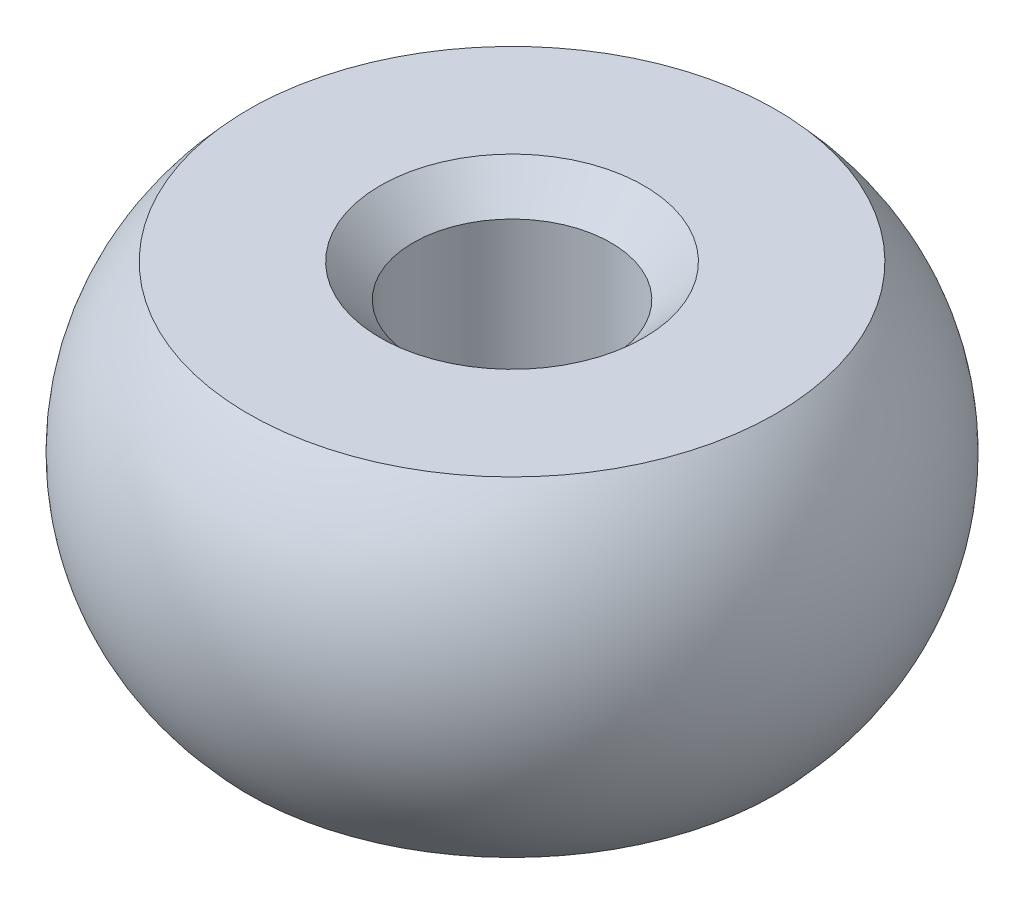
ISO-10303-21;
HEADER;
FILE_DESCRIPTION(('STEP AP214'),'2;1');
FILE_NAME('part.step','',(''),(''),'','','');
FILE_SCHEMA(('AUTOMOTIVE_DESIGN { 1 0 10303 214 1 1 1 1 }'));
ENDSEC;
DATA;
#1=APPLICATION_CONTEXT('core data for automotive mechanical design processes');
#2=APPLICATION_PROTOCOL_DEFINITION('international standard','automotive_design',2000,#1);
#3=PRODUCT_CONTEXT('',#1,'mechanical');
#4=PRODUCT('Part','Part','',(#3));
#5=PRODUCT_RELATED_PRODUCT_CATEGORY('part','',(#4));
#6=PRODUCT_DEFINITION_FORMATION('','',#4);
#7=PRODUCT_DEFINITION_CONTEXT('part definition',#1,'design');
#8=PRODUCT_DEFINITION('design','',#6,#7);
#9=PRODUCT_DEFINITION_SHAPE('','',#8);
#10=(LENGTH_UNIT() NAMED_UNIT(*) SI_UNIT(.MILLI.,.METRE.));
#11=(NAMED_UNIT(*) PLANE_ANGLE_UNIT() SI_UNIT($,.RADIAN.));
#12=(NAMED_UNIT(*) SI_UNIT($,.STERADIAN.) SOLID_ANGLE_UNIT());
#13=UNCERTAINTY_MEASURE_WITH_UNIT(LENGTH_MEASURE(1.E-05),#10,'distance_accuracy_value','');
#14=(GEOMETRIC_REPRESENTATION_CONTEXT(3) GLOBAL_UNCERTAINTY_ASSIGNED_CONTEXT((#13)) GLOBAL_UNIT_ASSIGNED_CONTEXT((#10,
#11,#12)) REPRESENTATION_CONTEXT('',''));
#15=CARTESIAN_POINT('',(0.,0.,0.));
#16=DIRECTION('',(0.,0.,1.));
#17=DIRECTION('',(1.,0.,0.));
#18=AXIS2_PLACEMENT_3D('',#15,#16,#17);
#19=CARTESIAN_POINT('',(1.5,2.5,0.));
#20=DIRECTION('',(0.,1.,0.));
#21=DIRECTION('',(-1.,0.,0.));
#22=AXIS2_PLACEMENT_3D('',#19,#20,#21);
#23=PLANE('',#22);
#24=CARTESIAN_POINT('',(0.,2.49999999999999,0.));
#25=DIRECTION('',(0.,1.,0.));
#26=DIRECTION('',(-1.,0.,0.));
#27=AXIS2_PLACEMENT_3D('',#24,#25,#26);
#28=CIRCLE('',#27,1.99999999999998);
#29=CARTESIAN_POINT('',(-1.99999999999998,2.49999999999998,0.));
#30=VERTEX_POINT('',#29);
#31=EDGE_CURVE('E49',#30,#30,#28,.F.);
#32=ORIENTED_EDGE('',*,*,#31,.T.);
#33=EDGE_LOOP('',(#32));
#34=FACE_BOUND('',#33,.T.);
#35=CARTESIAN_POINT('',(0.,2.49999999999999,0.));
#36=DIRECTION('',(0.,-1.,0.));
#37=DIRECTION('',(1.,0.,0.));
#38=AXIS2_PLACEMENT_3D('',#35,#36,#37);
#39=CIRCLE('',#38,4.00000000000001);
#40=CARTESIAN_POINT('',(4.,2.5,0.));
#41=VERTEX_POINT('',#40);
#42=EDGE_CURVE('E54',#41,#41,#39,.T.);
#43=ORIENTED_EDGE('',*,*,#42,.F.);
#44=EDGE_LOOP('',(#43));
#45=FACE_BOUND('',#44,.T.);
#46=ADVANCED_FACE('F33',(#34,#45),#23,.T.);
#47=CARTESIAN_POINT('',(0.,0.,0.));
#48=DIRECTION('',(0.,-1.,0.));
#49=DIRECTION('',(1.,0.,0.));
#50=AXIS2_PLACEMENT_3D('',#47,#48,#49);
#51=DEGENERATE_TOROIDAL_SURFACE('',#50,1.375,3.625,.T.);
#52=ORIENTED_EDGE('',*,*,#42,.T.);
#53=EDGE_LOOP('',(#52));
#54=FACE_BOUND('',#53,.T.);
#55=CARTESIAN_POINT('',(0.,-2.50000000000002,0.));
#56=DIRECTION('',(0.,-1.,0.));
#57=DIRECTION('',(1.,0.,0.));
#58=AXIS2_PLACEMENT_3D('',#55,#56,#57);
#59=CIRCLE('',#58,3.99999999999999);
#60=CARTESIAN_POINT('',(4.,-2.5,0.));
#61=VERTEX_POINT('',#60);
#62=EDGE_CURVE('E57',#61,#61,#59,.T.);
#63=ORIENTED_EDGE('',*,*,#62,.F.);
#64=EDGE_LOOP('',(#63));
#65=FACE_BOUND('',#64,.T.);
#66=ADVANCED_FACE('F63',(#54,#65),#51,.T.);
#67=CARTESIAN_POINT('',(1.5,-2.5,0.));
#68=DIRECTION('',(0.,-1.,0.));
#69=DIRECTION('',(1.,0.,0.));
#70=AXIS2_PLACEMENT_3D('',#67,#68,#69);
#71=PLANE('',#70);
#72=CARTESIAN_POINT('',(0.,-2.50000000000001,0.));
#73=DIRECTION('',(0.,-1.,0.));
#74=DIRECTION('',(1.,0.,0.));
#75=AXIS2_PLACEMENT_3D('',#72,#73,#74);
#76=CIRCLE('',#75,2.00000000000001);
#77=CARTESIAN_POINT('',(2.00000000000002,-2.5,0.));
#78=VERTEX_POINT('',#77);
#79=EDGE_CURVE('E10',#78,#78,#76,.F.);
#80=ORIENTED_EDGE('',*,*,#79,.T.);
#81=EDGE_LOOP('',(#80));
#82=FACE_BOUND('',#81,.T.);
#83=ORIENTED_EDGE('',*,*,#62,.T.);
#84=EDGE_LOOP('',(#83));
#85=FACE_BOUND('',#84,.T.);
#86=ADVANCED_FACE('F61',(#82,#85),#71,.T.);
#87=CARTESIAN_POINT('',(3.11205444248753E-13,-90.72386417133,0.));
#88=DIRECTION('',(0.,-1.,0.));
#89=DIRECTION('',(1.,0.,0.));
#90=AXIS2_PLACEMENT_3D('',#87,#88,#89);
#91=CYLINDRICAL_SURFACE('',#90,1.5);
#92=CARTESIAN_POINT('',(0.,2.,0.));
#93=DIRECTION('',(0.,1.,0.));
#94=DIRECTION('',(-1.,0.,0.));
#95=AXIS2_PLACEMENT_3D('',#92,#93,#94);
#96=CIRCLE('',#95,1.5);
#97=CARTESIAN_POINT('',(-1.50000000000001,2.,0.));
#98=VERTEX_POINT('',#97);
#99=EDGE_CURVE('E41',#98,#98,#96,.T.);
#100=ORIENTED_EDGE('',*,*,#99,.T.);
#101=EDGE_LOOP('',(#100));
#102=FACE_BOUND('',#101,.T.);
#103=CARTESIAN_POINT('',(0.,-2.,0.));
#104=DIRECTION('',(0.,-1.,0.));
#105=DIRECTION('',(1.,0.,0.));
#106=AXIS2_PLACEMENT_3D('',#103,#104,#105);
#107=CIRCLE('',#106,1.5);
#108=CARTESIAN_POINT('',(1.50000000000001,-2.,0.));
#109=VERTEX_POINT('',#108);
#110=EDGE_CURVE('E45',#109,#109,#107,.T.);
#111=ORIENTED_EDGE('',*,*,#110,.T.);
#112=EDGE_LOOP('',(#111));
#113=FACE_BOUND('',#112,.T.);
#114=ADVANCED_FACE('F71',(#102,#113),#91,.F.);
#115=CARTESIAN_POINT('',(0.,2.5,0.));
#116=DIRECTION('',(0.,1.,0.));
#117=DIRECTION('',(-1.,0.,0.));
#118=AXIS2_PLACEMENT_3D('',#115,#116,#117);
#119=CONICAL_SURFACE('',#118,1.99999999999999,0.785398163397435);
#120=ORIENTED_EDGE('',*,*,#99,.F.);
#121=EDGE_LOOP('',(#120));
#122=FACE_BOUND('',#121,.T.);
#123=ORIENTED_EDGE('',*,*,#31,.F.);
#124=EDGE_LOOP('',(#123));
#125=FACE_BOUND('',#124,.T.);
#126=ADVANCED_FACE('F77',(#122,#125),#119,.F.);
#127=CARTESIAN_POINT('',(0.,-2.,0.));
#128=DIRECTION('',(0.,-1.,0.));
#129=DIRECTION('',(1.,0.,0.));
#130=AXIS2_PLACEMENT_3D('',#127,#128,#129);
#131=CONICAL_SURFACE('',#130,1.5,0.785398163397454);
#132=ORIENTED_EDGE('',*,*,#79,.F.);
#133=EDGE_LOOP('',(#132));
#134=FACE_BOUND('',#133,.T.);
#135=ORIENTED_EDGE('',*,*,#110,.F.);
#136=EDGE_LOOP('',(#135));
#137=FACE_BOUND('',#136,.T.);
#138=ADVANCED_FACE('F36',(#134,#137),#131,.F.);
#139=CLOSED_SHELL('',(#46,#66,#86,#114,#126,#138));
#140=MANIFOLD_SOLID_BREP('B2',#139);
#141=ADVANCED_BREP_SHAPE_REPRESENTATION('',(#18,#140),#14);
#142=SHAPE_DEFINITION_REPRESENTATION(#9,#141);
ENDSEC;
END-ISO-10303-21;
